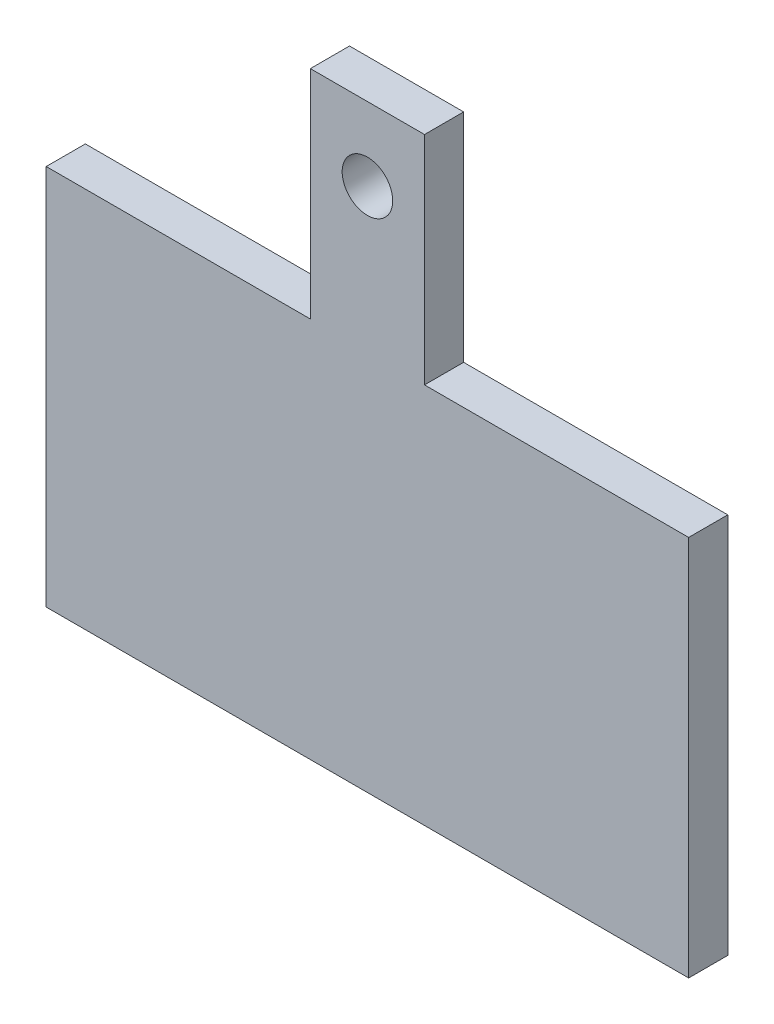
ISO-10303-21;
HEADER;
FILE_DESCRIPTION(('STEP AP214'),'2;1');
FILE_NAME('part.step','',(''),(''),'','','');
FILE_SCHEMA(('AUTOMOTIVE_DESIGN { 1 0 10303 214 1 1 1 1 }'));
ENDSEC;
DATA;
#1=APPLICATION_CONTEXT('core data for automotive mechanical design processes');
#2=APPLICATION_PROTOCOL_DEFINITION('international standard','automotive_design',2000,#1);
#3=PRODUCT_CONTEXT('',#1,'mechanical');
#4=PRODUCT('Part','Part','',(#3));
#5=PRODUCT_RELATED_PRODUCT_CATEGORY('part','',(#4));
#6=PRODUCT_DEFINITION_FORMATION('','',#4);
#7=PRODUCT_DEFINITION_CONTEXT('part definition',#1,'design');
#8=PRODUCT_DEFINITION('design','',#6,#7);
#9=PRODUCT_DEFINITION_SHAPE('','',#8);
#10=(LENGTH_UNIT() NAMED_UNIT(*) SI_UNIT(.MILLI.,.METRE.));
#11=(NAMED_UNIT(*) PLANE_ANGLE_UNIT() SI_UNIT($,.RADIAN.));
#12=(NAMED_UNIT(*) SI_UNIT($,.STERADIAN.) SOLID_ANGLE_UNIT());
#13=UNCERTAINTY_MEASURE_WITH_UNIT(LENGTH_MEASURE(1.E-05),#10,'distance_accuracy_value','');
#14=(GEOMETRIC_REPRESENTATION_CONTEXT(3) GLOBAL_UNCERTAINTY_ASSIGNED_CONTEXT((#13)) GLOBAL_UNIT_ASSIGNED_CONTEXT((#10,
#11,#12)) REPRESENTATION_CONTEXT('',''));
#15=CARTESIAN_POINT('',(0.,0.,0.));
#16=DIRECTION('',(0.,0.,1.));
#17=DIRECTION('',(1.,0.,0.));
#18=AXIS2_PLACEMENT_3D('',#15,#16,#17);
#19=CARTESIAN_POINT('',(-19.7,11.7,2.4));
#20=DIRECTION('',(0.,-1.,0.));
#21=DIRECTION('',(0.,0.,-1.));
#22=AXIS2_PLACEMENT_3D('',#19,#20,#21);
#23=PLANE('',#22);
#24=DIRECTION('',(0.,0.,1.));
#25=VECTOR('',#24,1.);
#26=CARTESIAN_POINT('',(-3.5,11.7,2.4));
#27=LINE('',#26,#25);
#28=CARTESIAN_POINT('',(-3.5,11.7,0.));
#29=VERTEX_POINT('',#28);
#30=CARTESIAN_POINT('',(-3.5,11.7,2.4));
#31=VERTEX_POINT('',#30);
#32=EDGE_CURVE('E144',#29,#31,#27,.T.);
#33=ORIENTED_EDGE('',*,*,#32,.F.);
#34=DIRECTION('',(-1.,0.,0.));
#35=VECTOR('',#34,1.);
#36=CARTESIAN_POINT('',(-19.7,11.7,0.));
#37=LINE('',#36,#35);
#38=CARTESIAN_POINT('',(-19.7,11.7,0.));
#39=VERTEX_POINT('',#38);
#40=EDGE_CURVE('E163',#29,#39,#37,.T.);
#41=ORIENTED_EDGE('',*,*,#40,.T.);
#42=DIRECTION('',(0.,0.,-1.));
#43=VECTOR('',#42,1.);
#44=CARTESIAN_POINT('',(-19.7,11.7,2.4));
#45=LINE('',#44,#43);
#46=CARTESIAN_POINT('',(-19.7,11.7,2.4));
#47=VERTEX_POINT('',#46);
#48=EDGE_CURVE('E156',#47,#39,#45,.T.);
#49=ORIENTED_EDGE('',*,*,#48,.F.);
#50=DIRECTION('',(-1.,0.,0.));
#51=VECTOR('',#50,1.);
#52=CARTESIAN_POINT('',(-19.7,11.7,2.4));
#53=LINE('',#52,#51);
#54=EDGE_CURVE('E58',#31,#47,#53,.T.);
#55=ORIENTED_EDGE('',*,*,#54,.F.);
#56=EDGE_LOOP('',(#33,#41,#49,#55));
#57=FACE_BOUND('',#56,.T.);
#58=ADVANCED_FACE('F43',(#57),#23,.F.);
#59=DIRECTION('',(0.,0.,-1.));
#60=VECTOR('',#59,1.);
#61=CARTESIAN_POINT('',(3.5,11.7,2.4));
#62=LINE('',#61,#60);
#63=CARTESIAN_POINT('',(3.5,11.7,2.4));
#64=VERTEX_POINT('',#63);
#65=CARTESIAN_POINT('',(3.5,11.7,0.));
#66=VERTEX_POINT('',#65);
#67=EDGE_CURVE('E66',#64,#66,#62,.T.);
#68=ORIENTED_EDGE('',*,*,#67,.F.);
#69=CARTESIAN_POINT('',(19.7,11.7,2.4));
#70=VERTEX_POINT('',#69);
#71=EDGE_CURVE('E116',#70,#64,#53,.T.);
#72=ORIENTED_EDGE('',*,*,#71,.F.);
#73=DIRECTION('',(0.,0.,-1.));
#74=VECTOR('',#73,1.);
#75=CARTESIAN_POINT('',(19.7,11.7,2.4));
#76=LINE('',#75,#74);
#77=CARTESIAN_POINT('',(19.7,11.7,0.));
#78=VERTEX_POINT('',#77);
#79=EDGE_CURVE('E167',#70,#78,#76,.T.);
#80=ORIENTED_EDGE('',*,*,#79,.T.);
#81=EDGE_CURVE('E151',#78,#66,#37,.T.);
#82=ORIENTED_EDGE('',*,*,#81,.T.);
#83=EDGE_LOOP('',(#68,#72,#80,#82));
#84=FACE_BOUND('',#83,.T.);
#85=ADVANCED_FACE('F183',(#84),#23,.F.);
#86=CARTESIAN_POINT('',(-19.7,-11.7,2.4));
#87=DIRECTION('',(1.,0.,0.));
#88=DIRECTION('',(0.,0.,-1.));
#89=AXIS2_PLACEMENT_3D('',#86,#87,#88);
#90=PLANE('',#89);
#91=DIRECTION('',(0.,-1.,0.));
#92=VECTOR('',#91,1.);
#93=CARTESIAN_POINT('',(-19.7,-11.7,0.));
#94=LINE('',#93,#92);
#95=CARTESIAN_POINT('',(-19.7,-11.7,0.));
#96=VERTEX_POINT('',#95);
#97=EDGE_CURVE('E146',#39,#96,#94,.T.);
#98=ORIENTED_EDGE('',*,*,#97,.T.);
#99=DIRECTION('',(0.,0.,-1.));
#100=VECTOR('',#99,1.);
#101=CARTESIAN_POINT('',(-19.7,-11.7,2.4));
#102=LINE('',#101,#100);
#103=CARTESIAN_POINT('',(-19.7,-11.7,2.4));
#104=VERTEX_POINT('',#103);
#105=EDGE_CURVE('E11',#104,#96,#102,.T.);
#106=ORIENTED_EDGE('',*,*,#105,.F.);
#107=DIRECTION('',(0.,-1.,0.));
#108=VECTOR('',#107,1.);
#109=CARTESIAN_POINT('',(-19.7,-11.7,2.4));
#110=LINE('',#109,#108);
#111=EDGE_CURVE('E147',#47,#104,#110,.T.);
#112=ORIENTED_EDGE('',*,*,#111,.F.);
#113=ORIENTED_EDGE('',*,*,#48,.T.);
#114=EDGE_LOOP('',(#98,#106,#112,#113));
#115=FACE_BOUND('',#114,.T.);
#116=ADVANCED_FACE('F45',(#115),#90,.F.);
#117=CARTESIAN_POINT('',(-19.7,-11.7,2.4));
#118=DIRECTION('',(0.,1.,0.));
#119=DIRECTION('',(0.,0.,1.));
#120=AXIS2_PLACEMENT_3D('',#117,#118,#119);
#121=PLANE('',#120);
#122=DIRECTION('',(1.,0.,0.));
#123=VECTOR('',#122,1.);
#124=CARTESIAN_POINT('',(-19.7,-11.7,0.));
#125=LINE('',#124,#123);
#126=CARTESIAN_POINT('',(19.7,-11.7,0.));
#127=VERTEX_POINT('',#126);
#128=EDGE_CURVE('E159',#96,#127,#125,.T.);
#129=ORIENTED_EDGE('',*,*,#128,.T.);
#130=DIRECTION('',(0.,0.,-1.));
#131=VECTOR('',#130,1.);
#132=CARTESIAN_POINT('',(19.7,-11.7,2.4));
#133=LINE('',#132,#131);
#134=CARTESIAN_POINT('',(19.7,-11.7,2.4));
#135=VERTEX_POINT('',#134);
#136=EDGE_CURVE('E51',#135,#127,#133,.T.);
#137=ORIENTED_EDGE('',*,*,#136,.F.);
#138=DIRECTION('',(1.,0.,0.));
#139=VECTOR('',#138,1.);
#140=CARTESIAN_POINT('',(-19.7,-11.7,2.4));
#141=LINE('',#140,#139);
#142=EDGE_CURVE('E150',#104,#135,#141,.T.);
#143=ORIENTED_EDGE('',*,*,#142,.F.);
#144=ORIENTED_EDGE('',*,*,#105,.T.);
#145=EDGE_LOOP('',(#129,#137,#143,#144));
#146=FACE_BOUND('',#145,.T.);
#147=ADVANCED_FACE('F191',(#146),#121,.F.);
#148=CARTESIAN_POINT('',(19.7,-11.7,2.4));
#149=DIRECTION('',(-1.,0.,0.));
#150=DIRECTION('',(0.,0.,1.));
#151=AXIS2_PLACEMENT_3D('',#148,#149,#150);
#152=PLANE('',#151);
#153=DIRECTION('',(0.,1.,0.));
#154=VECTOR('',#153,1.);
#155=CARTESIAN_POINT('',(19.7,-11.7,0.));
#156=LINE('',#155,#154);
#157=EDGE_CURVE('E161',#127,#78,#156,.T.);
#158=ORIENTED_EDGE('',*,*,#157,.T.);
#159=ORIENTED_EDGE('',*,*,#79,.F.);
#160=DIRECTION('',(0.,1.,0.));
#161=VECTOR('',#160,1.);
#162=CARTESIAN_POINT('',(19.7,-11.7,2.4));
#163=LINE('',#162,#161);
#164=EDGE_CURVE('E153',#135,#70,#163,.T.);
#165=ORIENTED_EDGE('',*,*,#164,.F.);
#166=ORIENTED_EDGE('',*,*,#136,.T.);
#167=EDGE_LOOP('',(#158,#159,#165,#166));
#168=FACE_BOUND('',#167,.T.);
#169=ADVANCED_FACE('F174',(#168),#152,.F.);
#170=CARTESIAN_POINT('',(0.,0.,2.4));
#171=DIRECTION('',(0.,0.,-1.));
#172=DIRECTION('',(-1.,0.,0.));
#173=AXIS2_PLACEMENT_3D('',#170,#171,#172);
#174=PLANE('',#173);
#175=ORIENTED_EDGE('',*,*,#71,.T.);
#176=DIRECTION('',(0.,1.,0.));
#177=VECTOR('',#176,1.);
#178=CARTESIAN_POINT('',(3.5,11.,2.4));
#179=LINE('',#178,#177);
#180=CARTESIAN_POINT('',(3.5,25.,2.4));
#181=VERTEX_POINT('',#180);
#182=EDGE_CURVE('E108',#64,#181,#179,.T.);
#183=ORIENTED_EDGE('',*,*,#182,.T.);
#184=DIRECTION('',(-1.,0.,0.));
#185=VECTOR('',#184,1.);
#186=CARTESIAN_POINT('',(-3.5,25.,2.4));
#187=LINE('',#186,#185);
#188=CARTESIAN_POINT('',(-3.5,25.,2.4));
#189=VERTEX_POINT('',#188);
#190=EDGE_CURVE('E114',#181,#189,#187,.T.);
#191=ORIENTED_EDGE('',*,*,#190,.T.);
#192=DIRECTION('',(0.,-1.,0.));
#193=VECTOR('',#192,1.);
#194=CARTESIAN_POINT('',(-3.5,11.,2.4));
#195=LINE('',#194,#193);
#196=EDGE_CURVE('E118',#189,#31,#195,.T.);
#197=ORIENTED_EDGE('',*,*,#196,.T.);
#198=ORIENTED_EDGE('',*,*,#54,.T.);
#199=ORIENTED_EDGE('',*,*,#111,.T.);
#200=ORIENTED_EDGE('',*,*,#142,.T.);
#201=ORIENTED_EDGE('',*,*,#164,.T.);
#202=EDGE_LOOP('',(#175,#183,#191,#197,#198,#199,#200,#201));
#203=FACE_BOUND('',#202,.T.);
#204=CARTESIAN_POINT('',(0.,20.5,2.4));
#205=DIRECTION('',(0.,0.,1.));
#206=DIRECTION('',(1.,0.,0.));
#207=AXIS2_PLACEMENT_3D('',#204,#205,#206);
#208=CIRCLE('',#207,1.55);
#209=CARTESIAN_POINT('',(1.55,20.5,2.4));
#210=VERTEX_POINT('',#209);
#211=EDGE_CURVE('E139',#210,#210,#208,.T.);
#212=ORIENTED_EDGE('',*,*,#211,.F.);
#213=EDGE_LOOP('',(#212));
#214=FACE_BOUND('',#213,.T.);
#215=ADVANCED_FACE('F110',(#203,#214),#174,.F.);
#216=CARTESIAN_POINT('',(0.,0.,0.));
#217=DIRECTION('',(0.,0.,-1.));
#218=DIRECTION('',(-1.,0.,0.));
#219=AXIS2_PLACEMENT_3D('',#216,#217,#218);
#220=PLANE('',#219);
#221=ORIENTED_EDGE('',*,*,#40,.F.);
#222=DIRECTION('',(0.,-1.,0.));
#223=VECTOR('',#222,1.);
#224=CARTESIAN_POINT('',(-3.5,11.,0.));
#225=LINE('',#224,#223);
#226=CARTESIAN_POINT('',(-3.5,25.,0.));
#227=VERTEX_POINT('',#226);
#228=EDGE_CURVE('E136',#227,#29,#225,.T.);
#229=ORIENTED_EDGE('',*,*,#228,.F.);
#230=DIRECTION('',(-1.,0.,0.));
#231=VECTOR('',#230,1.);
#232=CARTESIAN_POINT('',(-3.5,25.,0.));
#233=LINE('',#232,#231);
#234=CARTESIAN_POINT('',(3.5,25.,0.));
#235=VERTEX_POINT('',#234);
#236=EDGE_CURVE('E141',#235,#227,#233,.T.);
#237=ORIENTED_EDGE('',*,*,#236,.F.);
#238=DIRECTION('',(0.,1.,0.));
#239=VECTOR('',#238,1.);
#240=CARTESIAN_POINT('',(3.5,11.,0.));
#241=LINE('',#240,#239);
#242=EDGE_CURVE('E124',#66,#235,#241,.T.);
#243=ORIENTED_EDGE('',*,*,#242,.F.);
#244=ORIENTED_EDGE('',*,*,#81,.F.);
#245=ORIENTED_EDGE('',*,*,#157,.F.);
#246=ORIENTED_EDGE('',*,*,#128,.F.);
#247=ORIENTED_EDGE('',*,*,#97,.F.);
#248=EDGE_LOOP('',(#221,#229,#237,#243,#244,#245,#246,#247));
#249=FACE_BOUND('',#248,.T.);
#250=CARTESIAN_POINT('',(0.,20.5,0.));
#251=DIRECTION('',(0.,0.,1.));
#252=DIRECTION('',(1.,0.,0.));
#253=AXIS2_PLACEMENT_3D('',#250,#251,#252);
#254=CIRCLE('',#253,1.55);
#255=CARTESIAN_POINT('',(1.55,20.5,0.));
#256=VERTEX_POINT('',#255);
#257=EDGE_CURVE('E206',#256,#256,#254,.T.);
#258=ORIENTED_EDGE('',*,*,#257,.T.);
#259=EDGE_LOOP('',(#258));
#260=FACE_BOUND('',#259,.T.);
#261=ADVANCED_FACE('F180',(#249,#260),#220,.T.);
#262=CARTESIAN_POINT('',(-3.5,11.,2.4));
#263=DIRECTION('',(1.,0.,0.));
#264=DIRECTION('',(0.,0.,-1.));
#265=AXIS2_PLACEMENT_3D('',#262,#263,#264);
#266=PLANE('',#265);
#267=ORIENTED_EDGE('',*,*,#228,.T.);
#268=ORIENTED_EDGE('',*,*,#32,.T.);
#269=ORIENTED_EDGE('',*,*,#196,.F.);
#270=DIRECTION('',(0.,0.,-1.));
#271=VECTOR('',#270,1.);
#272=CARTESIAN_POINT('',(-3.5,25.,2.4));
#273=LINE('',#272,#271);
#274=EDGE_CURVE('E127',#189,#227,#273,.T.);
#275=ORIENTED_EDGE('',*,*,#274,.T.);
#276=EDGE_LOOP('',(#267,#268,#269,#275));
#277=FACE_BOUND('',#276,.T.);
#278=ADVANCED_FACE('F204',(#277),#266,.F.);
#279=CARTESIAN_POINT('',(3.5,11.,2.4));
#280=DIRECTION('',(-1.,0.,0.));
#281=DIRECTION('',(0.,0.,1.));
#282=AXIS2_PLACEMENT_3D('',#279,#280,#281);
#283=PLANE('',#282);
#284=ORIENTED_EDGE('',*,*,#182,.F.);
#285=ORIENTED_EDGE('',*,*,#67,.T.);
#286=ORIENTED_EDGE('',*,*,#242,.T.);
#287=DIRECTION('',(0.,0.,-1.));
#288=VECTOR('',#287,1.);
#289=CARTESIAN_POINT('',(3.5,25.,2.4));
#290=LINE('',#289,#288);
#291=EDGE_CURVE('E121',#181,#235,#290,.T.);
#292=ORIENTED_EDGE('',*,*,#291,.F.);
#293=EDGE_LOOP('',(#284,#285,#286,#292));
#294=FACE_BOUND('',#293,.T.);
#295=ADVANCED_FACE('F122',(#294),#283,.F.);
#296=CARTESIAN_POINT('',(-3.5,25.,2.4));
#297=DIRECTION('',(0.,-1.,0.));
#298=DIRECTION('',(0.,0.,-1.));
#299=AXIS2_PLACEMENT_3D('',#296,#297,#298);
#300=PLANE('',#299);
#301=ORIENTED_EDGE('',*,*,#236,.T.);
#302=ORIENTED_EDGE('',*,*,#274,.F.);
#303=ORIENTED_EDGE('',*,*,#190,.F.);
#304=ORIENTED_EDGE('',*,*,#291,.T.);
#305=EDGE_LOOP('',(#301,#302,#303,#304));
#306=FACE_BOUND('',#305,.T.);
#307=ADVANCED_FACE('F129',(#306),#300,.F.);
#308=CARTESIAN_POINT('',(0.,20.5,2.4));
#309=DIRECTION('',(0.,0.,-1.));
#310=DIRECTION('',(-1.,0.,0.));
#311=AXIS2_PLACEMENT_3D('',#308,#309,#310);
#312=CYLINDRICAL_SURFACE('',#311,1.55);
#313=ORIENTED_EDGE('',*,*,#211,.T.);
#314=EDGE_LOOP('',(#313));
#315=FACE_BOUND('',#314,.T.);
#316=ORIENTED_EDGE('',*,*,#257,.F.);
#317=EDGE_LOOP('',(#316));
#318=FACE_BOUND('',#317,.T.);
#319=ADVANCED_FACE('F212',(#315,#318),#312,.F.);
#320=CLOSED_SHELL('',(#58,#85,#116,#147,#169,#215,#261,#278,#295,#307,#319));
#321=MANIFOLD_SOLID_BREP('B2',#320);
#322=ADVANCED_BREP_SHAPE_REPRESENTATION('',(#18,#321),#14);
#323=SHAPE_DEFINITION_REPRESENTATION(#9,#322);
ENDSEC;
END-ISO-10303-21;
